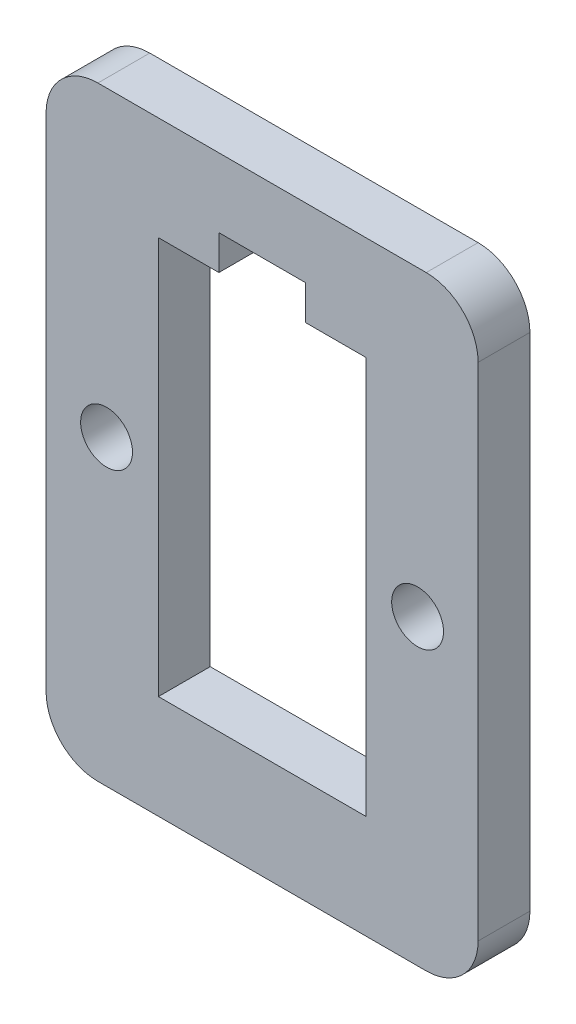
ISO-10303-21;
HEADER;
FILE_DESCRIPTION(('STEP AP214'),'2;1');
FILE_NAME('part.step','',(''),(''),'','','');
FILE_SCHEMA(('AUTOMOTIVE_DESIGN { 1 0 10303 214 1 1 1 1 }'));
ENDSEC;
DATA;
#1=APPLICATION_CONTEXT('core data for automotive mechanical design processes');
#2=APPLICATION_PROTOCOL_DEFINITION('international standard','automotive_design',2000,#1);
#3=PRODUCT_CONTEXT('',#1,'mechanical');
#4=PRODUCT('Part','Part','',(#3));
#5=PRODUCT_RELATED_PRODUCT_CATEGORY('part','',(#4));
#6=PRODUCT_DEFINITION_FORMATION('','',#4);
#7=PRODUCT_DEFINITION_CONTEXT('part definition',#1,'design');
#8=PRODUCT_DEFINITION('design','',#6,#7);
#9=PRODUCT_DEFINITION_SHAPE('','',#8);
#10=(LENGTH_UNIT() NAMED_UNIT(*) SI_UNIT(.MILLI.,.METRE.));
#11=(NAMED_UNIT(*) PLANE_ANGLE_UNIT() SI_UNIT($,.RADIAN.));
#12=(NAMED_UNIT(*) SI_UNIT($,.STERADIAN.) SOLID_ANGLE_UNIT());
#13=UNCERTAINTY_MEASURE_WITH_UNIT(LENGTH_MEASURE(1.E-05),#10,'distance_accuracy_value','');
#14=(GEOMETRIC_REPRESENTATION_CONTEXT(3) GLOBAL_UNCERTAINTY_ASSIGNED_CONTEXT((#13)) GLOBAL_UNIT_ASSIGNED_CONTEXT((#10,
#11,#12)) REPRESENTATION_CONTEXT('',''));
#15=CARTESIAN_POINT('',(0.,0.,0.));
#16=DIRECTION('',(0.,0.,1.));
#17=DIRECTION('',(1.,0.,0.));
#18=AXIS2_PLACEMENT_3D('',#15,#16,#17);
#19=CARTESIAN_POINT('',(155.0002,74.,3.));
#20=DIRECTION('',(0.,0.,1.));
#21=DIRECTION('',(1.,0.,0.));
#22=AXIS2_PLACEMENT_3D('',#19,#20,#21);
#23=PLANE('',#22);
#24=CARTESIAN_POINT('',(155.500199998333,88.4999999983335,3.));
#25=DIRECTION('',(0.,0.,1.));
#26=DIRECTION('',(1.,0.,0.));
#27=AXIS2_PLACEMENT_3D('',#24,#25,#26);
#28=CIRCLE('',#27,1.50000000166657);
#29=CARTESIAN_POINT('',(157.0002,88.4999999983335,3.));
#30=VERTEX_POINT('',#29);
#31=EDGE_CURVE('E184',#30,#30,#28,.T.);
#32=ORIENTED_EDGE('',*,*,#31,.F.);
#33=EDGE_LOOP('',(#32));
#34=FACE_BOUND('',#33,.T.);
#35=CARTESIAN_POINT('',(155.0002,74.,3.));
#36=DIRECTION('',(0.,0.,1.));
#37=DIRECTION('',(1.,0.,0.));
#38=AXIS2_PLACEMENT_3D('',#35,#36,#37);
#39=CIRCLE('',#38,2.99999999999998);
#40=CARTESIAN_POINT('',(152.0002,74.,3.));
#41=VERTEX_POINT('',#40);
#42=CARTESIAN_POINT('',(155.0002,71.,3.));
#43=VERTEX_POINT('',#42);
#44=EDGE_CURVE('E214',#41,#43,#39,.T.);
#45=ORIENTED_EDGE('',*,*,#44,.T.);
#46=DIRECTION('',(1.,0.,0.));
#47=VECTOR('',#46,1.);
#48=CARTESIAN_POINT('',(155.0002,71.,3.));
#49=LINE('',#48,#47);
#50=CARTESIAN_POINT('',(174.0002,71.,3.));
#51=VERTEX_POINT('',#50);
#52=EDGE_CURVE('E217',#43,#51,#49,.T.);
#53=ORIENTED_EDGE('',*,*,#52,.T.);
#54=CARTESIAN_POINT('',(174.0002,74.,3.));
#55=DIRECTION('',(0.,0.,1.));
#56=DIRECTION('',(1.,0.,0.));
#57=AXIS2_PLACEMENT_3D('',#54,#55,#56);
#58=CIRCLE('',#57,3.00000000000002);
#59=CARTESIAN_POINT('',(177.0002,74.,3.));
#60=VERTEX_POINT('',#59);
#61=EDGE_CURVE('E220',#51,#60,#58,.T.);
#62=ORIENTED_EDGE('',*,*,#61,.T.);
#63=DIRECTION('',(0.,1.,0.));
#64=VECTOR('',#63,1.);
#65=CARTESIAN_POINT('',(177.0002,74.,3.));
#66=LINE('',#65,#64);
#67=CARTESIAN_POINT('',(177.0002,103.,3.));
#68=VERTEX_POINT('',#67);
#69=EDGE_CURVE('E222',#60,#68,#66,.T.);
#70=ORIENTED_EDGE('',*,*,#69,.T.);
#71=CARTESIAN_POINT('',(174.0002,103.,3.));
#72=DIRECTION('',(0.,0.,1.));
#73=DIRECTION('',(1.,0.,0.));
#74=AXIS2_PLACEMENT_3D('',#71,#72,#73);
#75=CIRCLE('',#74,3.00000000000002);
#76=CARTESIAN_POINT('',(174.0002,106.,3.));
#77=VERTEX_POINT('',#76);
#78=EDGE_CURVE('E224',#68,#77,#75,.T.);
#79=ORIENTED_EDGE('',*,*,#78,.T.);
#80=DIRECTION('',(-1.,0.,0.));
#81=VECTOR('',#80,1.);
#82=CARTESIAN_POINT('',(155.0002,106.,3.));
#83=LINE('',#82,#81);
#84=CARTESIAN_POINT('',(155.0002,106.,3.));
#85=VERTEX_POINT('',#84);
#86=EDGE_CURVE('E226',#77,#85,#83,.T.);
#87=ORIENTED_EDGE('',*,*,#86,.T.);
#88=CARTESIAN_POINT('',(155.0002,103.,3.));
#89=DIRECTION('',(0.,0.,1.));
#90=DIRECTION('',(1.,0.,0.));
#91=AXIS2_PLACEMENT_3D('',#88,#89,#90);
#92=CIRCLE('',#91,2.99999999999998);
#93=CARTESIAN_POINT('',(152.0002,103.,3.));
#94=VERTEX_POINT('',#93);
#95=EDGE_CURVE('E228',#85,#94,#92,.T.);
#96=ORIENTED_EDGE('',*,*,#95,.T.);
#97=DIRECTION('',(0.,-1.,0.));
#98=VECTOR('',#97,1.);
#99=CARTESIAN_POINT('',(152.0002,103.,3.));
#100=LINE('',#99,#98);
#101=EDGE_CURVE('E230',#94,#41,#100,.T.);
#102=ORIENTED_EDGE('',*,*,#101,.T.);
#103=EDGE_LOOP('',(#45,#53,#62,#70,#79,#87,#96,#102));
#104=FACE_BOUND('',#103,.T.);
#105=DIRECTION('',(0.,1.,0.));
#106=VECTOR('',#105,1.);
#107=CARTESIAN_POINT('',(170.5002,76.9999999999999,3.));
#108=LINE('',#107,#106);
#109=CARTESIAN_POINT('',(170.5002,76.9999999999999,3.));
#110=VERTEX_POINT('',#109);
#111=CARTESIAN_POINT('',(170.5002,100.,3.));
#112=VERTEX_POINT('',#111);
#113=EDGE_CURVE('E154',#110,#112,#108,.T.);
#114=ORIENTED_EDGE('',*,*,#113,.F.);
#115=DIRECTION('',(1.,0.,0.));
#116=VECTOR('',#115,1.);
#117=CARTESIAN_POINT('',(158.5002,77.,3.));
#118=LINE('',#117,#116);
#119=CARTESIAN_POINT('',(158.5002,77.,3.));
#120=VERTEX_POINT('',#119);
#121=EDGE_CURVE('E146',#120,#110,#118,.T.);
#122=ORIENTED_EDGE('',*,*,#121,.F.);
#123=DIRECTION('',(0.,-1.,0.));
#124=VECTOR('',#123,1.);
#125=CARTESIAN_POINT('',(158.5002,100.,3.));
#126=LINE('',#125,#124);
#127=CARTESIAN_POINT('',(158.5002,100.,3.));
#128=VERTEX_POINT('',#127);
#129=EDGE_CURVE('E181',#128,#120,#126,.T.);
#130=ORIENTED_EDGE('',*,*,#129,.F.);
#131=DIRECTION('',(-1.,0.,0.));
#132=VECTOR('',#131,1.);
#133=CARTESIAN_POINT('',(162.0002,100.,3.));
#134=LINE('',#133,#132);
#135=CARTESIAN_POINT('',(162.0002,100.,3.));
#136=VERTEX_POINT('',#135);
#137=EDGE_CURVE('E179',#136,#128,#134,.T.);
#138=ORIENTED_EDGE('',*,*,#137,.F.);
#139=DIRECTION('',(0.,-1.,0.));
#140=VECTOR('',#139,1.);
#141=CARTESIAN_POINT('',(162.0002,102.0001,3.));
#142=LINE('',#141,#140);
#143=CARTESIAN_POINT('',(162.0002,102.0001,3.));
#144=VERTEX_POINT('',#143);
#145=EDGE_CURVE('E177',#144,#136,#142,.T.);
#146=ORIENTED_EDGE('',*,*,#145,.F.);
#147=DIRECTION('',(-1.,0.,0.));
#148=VECTOR('',#147,1.);
#149=CARTESIAN_POINT('',(167.0002,102.0001,3.));
#150=LINE('',#149,#148);
#151=CARTESIAN_POINT('',(167.0002,102.0001,3.));
#152=VERTEX_POINT('',#151);
#153=EDGE_CURVE('E175',#152,#144,#150,.T.);
#154=ORIENTED_EDGE('',*,*,#153,.F.);
#155=DIRECTION('',(0.,1.,0.));
#156=VECTOR('',#155,1.);
#157=CARTESIAN_POINT('',(167.0002,100.,3.));
#158=LINE('',#157,#156);
#159=CARTESIAN_POINT('',(167.0002,100.,3.));
#160=VERTEX_POINT('',#159);
#161=EDGE_CURVE('E170',#160,#152,#158,.T.);
#162=ORIENTED_EDGE('',*,*,#161,.F.);
#163=DIRECTION('',(-1.,0.,0.));
#164=VECTOR('',#163,1.);
#165=CARTESIAN_POINT('',(170.5002,100.,3.));
#166=LINE('',#165,#164);
#167=EDGE_CURVE('E168',#112,#160,#166,.T.);
#168=ORIENTED_EDGE('',*,*,#167,.F.);
#169=EDGE_LOOP('',(#114,#122,#130,#138,#146,#154,#162,#168));
#170=FACE_BOUND('',#169,.T.);
#171=CARTESIAN_POINT('',(173.500199998333,88.4999999983335,3.));
#172=DIRECTION('',(0.,0.,1.));
#173=DIRECTION('',(1.,0.,0.));
#174=AXIS2_PLACEMENT_3D('',#171,#172,#173);
#175=CIRCLE('',#174,1.50000000166663);
#176=CARTESIAN_POINT('',(175.0002,88.4999999983335,3.));
#177=VERTEX_POINT('',#176);
#178=EDGE_CURVE('E370',#177,#177,#175,.T.);
#179=ORIENTED_EDGE('',*,*,#178,.F.);
#180=EDGE_LOOP('',(#179));
#181=FACE_BOUND('',#180,.T.);
#182=ADVANCED_FACE('F33',(#34,#104,#170,#181),#23,.T.);
#183=CARTESIAN_POINT('',(155.0002,74.,0.));
#184=DIRECTION('',(0.,0.,1.));
#185=DIRECTION('',(1.,0.,0.));
#186=AXIS2_PLACEMENT_3D('',#183,#184,#185);
#187=PLANE('',#186);
#188=CARTESIAN_POINT('',(155.0002,74.,0.));
#189=DIRECTION('',(0.,0.,1.));
#190=DIRECTION('',(1.,0.,0.));
#191=AXIS2_PLACEMENT_3D('',#188,#189,#190);
#192=CIRCLE('',#191,2.99999999999998);
#193=CARTESIAN_POINT('',(152.0002,74.,0.));
#194=VERTEX_POINT('',#193);
#195=CARTESIAN_POINT('',(155.0002,71.,0.));
#196=VERTEX_POINT('',#195);
#197=EDGE_CURVE('E162',#194,#196,#192,.T.);
#198=ORIENTED_EDGE('',*,*,#197,.F.);
#199=DIRECTION('',(0.,-1.,0.));
#200=VECTOR('',#199,1.);
#201=CARTESIAN_POINT('',(152.0002,103.,0.));
#202=LINE('',#201,#200);
#203=CARTESIAN_POINT('',(152.0002,103.,0.));
#204=VERTEX_POINT('',#203);
#205=EDGE_CURVE('E218',#204,#194,#202,.T.);
#206=ORIENTED_EDGE('',*,*,#205,.F.);
#207=CARTESIAN_POINT('',(155.0002,103.,0.));
#208=DIRECTION('',(0.,0.,1.));
#209=DIRECTION('',(1.,0.,0.));
#210=AXIS2_PLACEMENT_3D('',#207,#208,#209);
#211=CIRCLE('',#210,2.99999999999998);
#212=CARTESIAN_POINT('',(155.0002,106.,0.));
#213=VERTEX_POINT('',#212);
#214=EDGE_CURVE('E245',#213,#204,#211,.T.);
#215=ORIENTED_EDGE('',*,*,#214,.F.);
#216=DIRECTION('',(-1.,0.,0.));
#217=VECTOR('',#216,1.);
#218=CARTESIAN_POINT('',(155.0002,106.,0.));
#219=LINE('',#218,#217);
#220=CARTESIAN_POINT('',(174.0002,106.,0.));
#221=VERTEX_POINT('',#220);
#222=EDGE_CURVE('E243',#221,#213,#219,.T.);
#223=ORIENTED_EDGE('',*,*,#222,.F.);
#224=CARTESIAN_POINT('',(174.0002,103.,0.));
#225=DIRECTION('',(0.,0.,1.));
#226=DIRECTION('',(1.,0.,0.));
#227=AXIS2_PLACEMENT_3D('',#224,#225,#226);
#228=CIRCLE('',#227,3.00000000000002);
#229=CARTESIAN_POINT('',(177.0002,103.,0.));
#230=VERTEX_POINT('',#229);
#231=EDGE_CURVE('E241',#230,#221,#228,.T.);
#232=ORIENTED_EDGE('',*,*,#231,.F.);
#233=DIRECTION('',(0.,1.,0.));
#234=VECTOR('',#233,1.);
#235=CARTESIAN_POINT('',(177.0002,74.,0.));
#236=LINE('',#235,#234);
#237=CARTESIAN_POINT('',(177.0002,74.,0.));
#238=VERTEX_POINT('',#237);
#239=EDGE_CURVE('E239',#238,#230,#236,.T.);
#240=ORIENTED_EDGE('',*,*,#239,.F.);
#241=CARTESIAN_POINT('',(174.0002,74.,0.));
#242=DIRECTION('',(0.,0.,1.));
#243=DIRECTION('',(1.,0.,0.));
#244=AXIS2_PLACEMENT_3D('',#241,#242,#243);
#245=CIRCLE('',#244,3.00000000000002);
#246=CARTESIAN_POINT('',(174.0002,71.,0.));
#247=VERTEX_POINT('',#246);
#248=EDGE_CURVE('E237',#247,#238,#245,.T.);
#249=ORIENTED_EDGE('',*,*,#248,.F.);
#250=DIRECTION('',(1.,0.,0.));
#251=VECTOR('',#250,1.);
#252=CARTESIAN_POINT('',(155.0002,71.,0.));
#253=LINE('',#252,#251);
#254=EDGE_CURVE('E235',#196,#247,#253,.T.);
#255=ORIENTED_EDGE('',*,*,#254,.F.);
#256=EDGE_LOOP('',(#198,#206,#215,#223,#232,#240,#249,#255));
#257=FACE_BOUND('',#256,.T.);
#258=DIRECTION('',(1.,0.,0.));
#259=VECTOR('',#258,1.);
#260=CARTESIAN_POINT('',(158.5002,77.,0.));
#261=LINE('',#260,#259);
#262=CARTESIAN_POINT('',(158.5002,77.,0.));
#263=VERTEX_POINT('',#262);
#264=CARTESIAN_POINT('',(170.5002,76.9999999999999,0.));
#265=VERTEX_POINT('',#264);
#266=EDGE_CURVE('E56',#263,#265,#261,.T.);
#267=ORIENTED_EDGE('',*,*,#266,.T.);
#268=DIRECTION('',(0.,1.,0.));
#269=VECTOR('',#268,1.);
#270=CARTESIAN_POINT('',(170.5002,76.9999999999999,0.));
#271=LINE('',#270,#269);
#272=CARTESIAN_POINT('',(170.5002,100.,0.));
#273=VERTEX_POINT('',#272);
#274=EDGE_CURVE('E161',#265,#273,#271,.T.);
#275=ORIENTED_EDGE('',*,*,#274,.T.);
#276=DIRECTION('',(-1.,0.,0.));
#277=VECTOR('',#276,1.);
#278=CARTESIAN_POINT('',(170.5002,100.,0.));
#279=LINE('',#278,#277);
#280=CARTESIAN_POINT('',(167.0002,100.,0.));
#281=VERTEX_POINT('',#280);
#282=EDGE_CURVE('E186',#273,#281,#279,.T.);
#283=ORIENTED_EDGE('',*,*,#282,.T.);
#284=DIRECTION('',(0.,1.,0.));
#285=VECTOR('',#284,1.);
#286=CARTESIAN_POINT('',(167.0002,100.,0.));
#287=LINE('',#286,#285);
#288=CARTESIAN_POINT('',(167.0002,102.0001,0.));
#289=VERTEX_POINT('',#288);
#290=EDGE_CURVE('E189',#281,#289,#287,.T.);
#291=ORIENTED_EDGE('',*,*,#290,.T.);
#292=DIRECTION('',(-1.,0.,0.));
#293=VECTOR('',#292,1.);
#294=CARTESIAN_POINT('',(167.0002,102.0001,0.));
#295=LINE('',#294,#293);
#296=CARTESIAN_POINT('',(162.0002,102.0001,0.));
#297=VERTEX_POINT('',#296);
#298=EDGE_CURVE('E192',#289,#297,#295,.T.);
#299=ORIENTED_EDGE('',*,*,#298,.T.);
#300=DIRECTION('',(0.,-1.,0.));
#301=VECTOR('',#300,1.);
#302=CARTESIAN_POINT('',(162.0002,102.0001,0.));
#303=LINE('',#302,#301);
#304=CARTESIAN_POINT('',(162.0002,100.,0.));
#305=VERTEX_POINT('',#304);
#306=EDGE_CURVE('E195',#297,#305,#303,.T.);
#307=ORIENTED_EDGE('',*,*,#306,.T.);
#308=DIRECTION('',(-1.,0.,0.));
#309=VECTOR('',#308,1.);
#310=CARTESIAN_POINT('',(162.0002,100.,0.));
#311=LINE('',#310,#309);
#312=CARTESIAN_POINT('',(158.5002,100.,0.));
#313=VERTEX_POINT('',#312);
#314=EDGE_CURVE('E198',#305,#313,#311,.T.);
#315=ORIENTED_EDGE('',*,*,#314,.T.);
#316=DIRECTION('',(0.,-1.,0.));
#317=VECTOR('',#316,1.);
#318=CARTESIAN_POINT('',(158.5002,100.,0.));
#319=LINE('',#318,#317);
#320=EDGE_CURVE('E155',#313,#263,#319,.T.);
#321=ORIENTED_EDGE('',*,*,#320,.T.);
#322=EDGE_LOOP('',(#267,#275,#283,#291,#299,#307,#315,#321));
#323=FACE_BOUND('',#322,.T.);
#324=CARTESIAN_POINT('',(155.500199998333,88.4999999983335,0.));
#325=DIRECTION('',(0.,0.,1.));
#326=DIRECTION('',(1.,0.,0.));
#327=AXIS2_PLACEMENT_3D('',#324,#325,#326);
#328=CIRCLE('',#327,1.50000000166657);
#329=CARTESIAN_POINT('',(157.0002,88.4999999983335,0.));
#330=VERTEX_POINT('',#329);
#331=EDGE_CURVE('E376',#330,#330,#328,.T.);
#332=ORIENTED_EDGE('',*,*,#331,.T.);
#333=EDGE_LOOP('',(#332));
#334=FACE_BOUND('',#333,.T.);
#335=CARTESIAN_POINT('',(173.500199998333,88.4999999983335,0.));
#336=DIRECTION('',(0.,0.,1.));
#337=DIRECTION('',(1.,0.,0.));
#338=AXIS2_PLACEMENT_3D('',#335,#336,#337);
#339=CIRCLE('',#338,1.50000000166663);
#340=CARTESIAN_POINT('',(175.0002,88.4999999983335,0.));
#341=VERTEX_POINT('',#340);
#342=EDGE_CURVE('E373',#341,#341,#339,.T.);
#343=ORIENTED_EDGE('',*,*,#342,.T.);
#344=EDGE_LOOP('',(#343));
#345=FACE_BOUND('',#344,.T.);
#346=ADVANCED_FACE('F275',(#257,#323,#334,#345),#187,.F.);
#347=CARTESIAN_POINT('',(155.0002,74.,3.));
#348=DIRECTION('',(0.,0.,-1.));
#349=DIRECTION('',(-1.,0.,0.));
#350=AXIS2_PLACEMENT_3D('',#347,#348,#349);
#351=CYLINDRICAL_SURFACE('',#350,2.99999999999998);
#352=ORIENTED_EDGE('',*,*,#197,.T.);
#353=DIRECTION('',(0.,0.,-1.));
#354=VECTOR('',#353,1.);
#355=CARTESIAN_POINT('',(155.0002,71.,3.));
#356=LINE('',#355,#354);
#357=EDGE_CURVE('E11',#43,#196,#356,.T.);
#358=ORIENTED_EDGE('',*,*,#357,.F.);
#359=ORIENTED_EDGE('',*,*,#44,.F.);
#360=DIRECTION('',(0.,0.,-1.));
#361=VECTOR('',#360,1.);
#362=CARTESIAN_POINT('',(152.0002,74.,3.));
#363=LINE('',#362,#361);
#364=EDGE_CURVE('E232',#41,#194,#363,.T.);
#365=ORIENTED_EDGE('',*,*,#364,.T.);
#366=EDGE_LOOP('',(#352,#358,#359,#365));
#367=FACE_BOUND('',#366,.T.);
#368=ADVANCED_FACE('F35',(#367),#351,.T.);
#369=CARTESIAN_POINT('',(155.0002,71.,3.));
#370=DIRECTION('',(0.,1.,0.));
#371=DIRECTION('',(0.,0.,1.));
#372=AXIS2_PLACEMENT_3D('',#369,#370,#371);
#373=PLANE('',#372);
#374=ORIENTED_EDGE('',*,*,#254,.T.);
#375=DIRECTION('',(0.,0.,-1.));
#376=VECTOR('',#375,1.);
#377=CARTESIAN_POINT('',(174.0002,71.,3.));
#378=LINE('',#377,#376);
#379=EDGE_CURVE('E41',#51,#247,#378,.T.);
#380=ORIENTED_EDGE('',*,*,#379,.F.);
#381=ORIENTED_EDGE('',*,*,#52,.F.);
#382=ORIENTED_EDGE('',*,*,#357,.T.);
#383=EDGE_LOOP('',(#374,#380,#381,#382));
#384=FACE_BOUND('',#383,.T.);
#385=ADVANCED_FACE('F292',(#384),#373,.F.);
#386=CARTESIAN_POINT('',(174.0002,74.,3.));
#387=DIRECTION('',(0.,0.,-1.));
#388=DIRECTION('',(-1.,0.,0.));
#389=AXIS2_PLACEMENT_3D('',#386,#387,#388);
#390=CYLINDRICAL_SURFACE('',#389,3.00000000000002);
#391=ORIENTED_EDGE('',*,*,#248,.T.);
#392=DIRECTION('',(0.,0.,-1.));
#393=VECTOR('',#392,1.);
#394=CARTESIAN_POINT('',(177.0002,74.,3.));
#395=LINE('',#394,#393);
#396=EDGE_CURVE('E262',#60,#238,#395,.T.);
#397=ORIENTED_EDGE('',*,*,#396,.F.);
#398=ORIENTED_EDGE('',*,*,#61,.F.);
#399=ORIENTED_EDGE('',*,*,#379,.T.);
#400=EDGE_LOOP('',(#391,#397,#398,#399));
#401=FACE_BOUND('',#400,.T.);
#402=ADVANCED_FACE('F269',(#401),#390,.T.);
#403=CARTESIAN_POINT('',(177.0002,74.,3.));
#404=DIRECTION('',(-1.,0.,0.));
#405=DIRECTION('',(0.,0.,1.));
#406=AXIS2_PLACEMENT_3D('',#403,#404,#405);
#407=PLANE('',#406);
#408=ORIENTED_EDGE('',*,*,#239,.T.);
#409=DIRECTION('',(0.,0.,-1.));
#410=VECTOR('',#409,1.);
#411=CARTESIAN_POINT('',(177.0002,103.,3.));
#412=LINE('',#411,#410);
#413=EDGE_CURVE('E259',#68,#230,#412,.T.);
#414=ORIENTED_EDGE('',*,*,#413,.F.);
#415=ORIENTED_EDGE('',*,*,#69,.F.);
#416=ORIENTED_EDGE('',*,*,#396,.T.);
#417=EDGE_LOOP('',(#408,#414,#415,#416));
#418=FACE_BOUND('',#417,.T.);
#419=ADVANCED_FACE('F281',(#418),#407,.F.);
#420=CARTESIAN_POINT('',(174.0002,103.,3.));
#421=DIRECTION('',(0.,0.,-1.));
#422=DIRECTION('',(-1.,0.,0.));
#423=AXIS2_PLACEMENT_3D('',#420,#421,#422);
#424=CYLINDRICAL_SURFACE('',#423,3.00000000000002);
#425=ORIENTED_EDGE('',*,*,#231,.T.);
#426=DIRECTION('',(0.,0.,-1.));
#427=VECTOR('',#426,1.);
#428=CARTESIAN_POINT('',(174.0002,106.,3.));
#429=LINE('',#428,#427);
#430=EDGE_CURVE('E256',#77,#221,#429,.T.);
#431=ORIENTED_EDGE('',*,*,#430,.F.);
#432=ORIENTED_EDGE('',*,*,#78,.F.);
#433=ORIENTED_EDGE('',*,*,#413,.T.);
#434=EDGE_LOOP('',(#425,#431,#432,#433));
#435=FACE_BOUND('',#434,.T.);
#436=ADVANCED_FACE('F285',(#435),#424,.T.);
#437=CARTESIAN_POINT('',(155.0002,106.,3.));
#438=DIRECTION('',(0.,-1.,0.));
#439=DIRECTION('',(0.,0.,-1.));
#440=AXIS2_PLACEMENT_3D('',#437,#438,#439);
#441=PLANE('',#440);
#442=ORIENTED_EDGE('',*,*,#222,.T.);
#443=DIRECTION('',(0.,0.,-1.));
#444=VECTOR('',#443,1.);
#445=CARTESIAN_POINT('',(155.0002,106.,3.));
#446=LINE('',#445,#444);
#447=EDGE_CURVE('E253',#85,#213,#446,.T.);
#448=ORIENTED_EDGE('',*,*,#447,.F.);
#449=ORIENTED_EDGE('',*,*,#86,.F.);
#450=ORIENTED_EDGE('',*,*,#430,.T.);
#451=EDGE_LOOP('',(#442,#448,#449,#450));
#452=FACE_BOUND('',#451,.T.);
#453=ADVANCED_FACE('F305',(#452),#441,.F.);
#454=CARTESIAN_POINT('',(155.0002,103.,3.));
#455=DIRECTION('',(0.,0.,-1.));
#456=DIRECTION('',(-1.,0.,0.));
#457=AXIS2_PLACEMENT_3D('',#454,#455,#456);
#458=CYLINDRICAL_SURFACE('',#457,2.99999999999998);
#459=ORIENTED_EDGE('',*,*,#214,.T.);
#460=DIRECTION('',(0.,0.,-1.));
#461=VECTOR('',#460,1.);
#462=CARTESIAN_POINT('',(152.0002,103.,3.));
#463=LINE('',#462,#461);
#464=EDGE_CURVE('E250',#94,#204,#463,.T.);
#465=ORIENTED_EDGE('',*,*,#464,.F.);
#466=ORIENTED_EDGE('',*,*,#95,.F.);
#467=ORIENTED_EDGE('',*,*,#447,.T.);
#468=EDGE_LOOP('',(#459,#465,#466,#467));
#469=FACE_BOUND('',#468,.T.);
#470=ADVANCED_FACE('F303',(#469),#458,.T.);
#471=CARTESIAN_POINT('',(152.0002,103.,3.));
#472=DIRECTION('',(1.,0.,0.));
#473=DIRECTION('',(0.,0.,-1.));
#474=AXIS2_PLACEMENT_3D('',#471,#472,#473);
#475=PLANE('',#474);
#476=ORIENTED_EDGE('',*,*,#205,.T.);
#477=ORIENTED_EDGE('',*,*,#364,.F.);
#478=ORIENTED_EDGE('',*,*,#101,.F.);
#479=ORIENTED_EDGE('',*,*,#464,.T.);
#480=EDGE_LOOP('',(#476,#477,#478,#479));
#481=FACE_BOUND('',#480,.T.);
#482=ADVANCED_FACE('F298',(#481),#475,.F.);
#483=CARTESIAN_POINT('',(158.5002,77.,3.));
#484=DIRECTION('',(0.,1.,0.));
#485=DIRECTION('',(-1.,0.,0.));
#486=AXIS2_PLACEMENT_3D('',#483,#484,#485);
#487=PLANE('',#486);
#488=ORIENTED_EDGE('',*,*,#266,.F.);
#489=DIRECTION('',(0.,0.,-1.));
#490=VECTOR('',#489,1.);
#491=CARTESIAN_POINT('',(158.5002,77.,3.));
#492=LINE('',#491,#490);
#493=EDGE_CURVE('E150',#120,#263,#492,.T.);
#494=ORIENTED_EDGE('',*,*,#493,.F.);
#495=ORIENTED_EDGE('',*,*,#121,.T.);
#496=DIRECTION('',(0.,0.,-1.));
#497=VECTOR('',#496,1.);
#498=CARTESIAN_POINT('',(170.5002,76.9999999999999,3.));
#499=LINE('',#498,#497);
#500=EDGE_CURVE('E149',#110,#265,#499,.T.);
#501=ORIENTED_EDGE('',*,*,#500,.T.);
#502=EDGE_LOOP('',(#488,#494,#495,#501));
#503=FACE_BOUND('',#502,.T.);
#504=ADVANCED_FACE('F148',(#503),#487,.T.);
#505=CARTESIAN_POINT('',(170.5002,76.9999999999999,3.));
#506=DIRECTION('',(-1.,0.,0.));
#507=DIRECTION('',(0.,0.,1.));
#508=AXIS2_PLACEMENT_3D('',#505,#506,#507);
#509=PLANE('',#508);
#510=ORIENTED_EDGE('',*,*,#274,.F.);
#511=ORIENTED_EDGE('',*,*,#500,.F.);
#512=ORIENTED_EDGE('',*,*,#113,.T.);
#513=DIRECTION('',(0.,0.,-1.));
#514=VECTOR('',#513,1.);
#515=CARTESIAN_POINT('',(170.5002,100.,3.));
#516=LINE('',#515,#514);
#517=EDGE_CURVE('E163',#112,#273,#516,.T.);
#518=ORIENTED_EDGE('',*,*,#517,.T.);
#519=EDGE_LOOP('',(#510,#511,#512,#518));
#520=FACE_BOUND('',#519,.T.);
#521=ADVANCED_FACE('F158',(#520),#509,.T.);
#522=CARTESIAN_POINT('',(170.5002,100.,3.));
#523=DIRECTION('',(0.,-1.,0.));
#524=DIRECTION('',(0.,0.,-1.));
#525=AXIS2_PLACEMENT_3D('',#522,#523,#524);
#526=PLANE('',#525);
#527=ORIENTED_EDGE('',*,*,#282,.F.);
#528=ORIENTED_EDGE('',*,*,#517,.F.);
#529=ORIENTED_EDGE('',*,*,#167,.T.);
#530=DIRECTION('',(0.,0.,-1.));
#531=VECTOR('',#530,1.);
#532=CARTESIAN_POINT('',(167.0002,100.,3.));
#533=LINE('',#532,#531);
#534=EDGE_CURVE('E211',#160,#281,#533,.T.);
#535=ORIENTED_EDGE('',*,*,#534,.T.);
#536=EDGE_LOOP('',(#527,#528,#529,#535));
#537=FACE_BOUND('',#536,.T.);
#538=ADVANCED_FACE('F332',(#537),#526,.T.);
#539=CARTESIAN_POINT('',(167.0002,100.,3.));
#540=DIRECTION('',(-1.,0.,0.));
#541=DIRECTION('',(0.,0.,1.));
#542=AXIS2_PLACEMENT_3D('',#539,#540,#541);
#543=PLANE('',#542);
#544=ORIENTED_EDGE('',*,*,#290,.F.);
#545=ORIENTED_EDGE('',*,*,#534,.F.);
#546=ORIENTED_EDGE('',*,*,#161,.T.);
#547=DIRECTION('',(0.,0.,-1.));
#548=VECTOR('',#547,1.);
#549=CARTESIAN_POINT('',(167.0002,102.0001,3.));
#550=LINE('',#549,#548);
#551=EDGE_CURVE('E209',#152,#289,#550,.T.);
#552=ORIENTED_EDGE('',*,*,#551,.T.);
#553=EDGE_LOOP('',(#544,#545,#546,#552));
#554=FACE_BOUND('',#553,.T.);
#555=ADVANCED_FACE('F336',(#554),#543,.T.);
#556=CARTESIAN_POINT('',(167.0002,102.0001,3.));
#557=DIRECTION('',(0.,-1.,0.));
#558=DIRECTION('',(0.,0.,-1.));
#559=AXIS2_PLACEMENT_3D('',#556,#557,#558);
#560=PLANE('',#559);
#561=ORIENTED_EDGE('',*,*,#298,.F.);
#562=ORIENTED_EDGE('',*,*,#551,.F.);
#563=ORIENTED_EDGE('',*,*,#153,.T.);
#564=DIRECTION('',(0.,0.,-1.));
#565=VECTOR('',#564,1.);
#566=CARTESIAN_POINT('',(162.0002,102.0001,3.));
#567=LINE('',#566,#565);
#568=EDGE_CURVE('E207',#144,#297,#567,.T.);
#569=ORIENTED_EDGE('',*,*,#568,.T.);
#570=EDGE_LOOP('',(#561,#562,#563,#569));
#571=FACE_BOUND('',#570,.T.);
#572=ADVANCED_FACE('F342',(#571),#560,.T.);
#573=CARTESIAN_POINT('',(162.0002,102.0001,3.));
#574=DIRECTION('',(1.,0.,0.));
#575=DIRECTION('',(0.,0.,-1.));
#576=AXIS2_PLACEMENT_3D('',#573,#574,#575);
#577=PLANE('',#576);
#578=ORIENTED_EDGE('',*,*,#306,.F.);
#579=ORIENTED_EDGE('',*,*,#568,.F.);
#580=ORIENTED_EDGE('',*,*,#145,.T.);
#581=DIRECTION('',(0.,0.,-1.));
#582=VECTOR('',#581,1.);
#583=CARTESIAN_POINT('',(162.0002,100.,3.));
#584=LINE('',#583,#582);
#585=EDGE_CURVE('E205',#136,#305,#584,.T.);
#586=ORIENTED_EDGE('',*,*,#585,.T.);
#587=EDGE_LOOP('',(#578,#579,#580,#586));
#588=FACE_BOUND('',#587,.T.);
#589=ADVANCED_FACE('F346',(#588),#577,.T.);
#590=CARTESIAN_POINT('',(162.0002,100.,3.));
#591=DIRECTION('',(0.,-1.,0.));
#592=DIRECTION('',(0.,0.,-1.));
#593=AXIS2_PLACEMENT_3D('',#590,#591,#592);
#594=PLANE('',#593);
#595=ORIENTED_EDGE('',*,*,#314,.F.);
#596=ORIENTED_EDGE('',*,*,#585,.F.);
#597=ORIENTED_EDGE('',*,*,#137,.T.);
#598=DIRECTION('',(0.,0.,-1.));
#599=VECTOR('',#598,1.);
#600=CARTESIAN_POINT('',(158.5002,100.,3.));
#601=LINE('',#600,#599);
#602=EDGE_CURVE('E48',#128,#313,#601,.T.);
#603=ORIENTED_EDGE('',*,*,#602,.T.);
#604=EDGE_LOOP('',(#595,#596,#597,#603));
#605=FACE_BOUND('',#604,.T.);
#606=ADVANCED_FACE('F350',(#605),#594,.T.);
#607=CARTESIAN_POINT('',(158.5002,100.,3.));
#608=DIRECTION('',(1.,0.,0.));
#609=DIRECTION('',(0.,0.,-1.));
#610=AXIS2_PLACEMENT_3D('',#607,#608,#609);
#611=PLANE('',#610);
#612=ORIENTED_EDGE('',*,*,#320,.F.);
#613=ORIENTED_EDGE('',*,*,#602,.F.);
#614=ORIENTED_EDGE('',*,*,#129,.T.);
#615=ORIENTED_EDGE('',*,*,#493,.T.);
#616=EDGE_LOOP('',(#612,#613,#614,#615));
#617=FACE_BOUND('',#616,.T.);
#618=ADVANCED_FACE('F354',(#617),#611,.T.);
#619=CARTESIAN_POINT('',(155.500199998333,88.4999999983335,3.));
#620=DIRECTION('',(0.,0.,-1.));
#621=DIRECTION('',(-1.,0.,0.));
#622=AXIS2_PLACEMENT_3D('',#619,#620,#621);
#623=CYLINDRICAL_SURFACE('',#622,1.50000000166657);
#624=ORIENTED_EDGE('',*,*,#31,.T.);
#625=EDGE_LOOP('',(#624));
#626=FACE_BOUND('',#625,.T.);
#627=ORIENTED_EDGE('',*,*,#331,.F.);
#628=EDGE_LOOP('',(#627));
#629=FACE_BOUND('',#628,.T.);
#630=ADVANCED_FACE('F358',(#626,#629),#623,.F.);
#631=CARTESIAN_POINT('',(173.500199998333,88.4999999983335,3.));
#632=DIRECTION('',(0.,0.,-1.));
#633=DIRECTION('',(-1.,0.,0.));
#634=AXIS2_PLACEMENT_3D('',#631,#632,#633);
#635=CYLINDRICAL_SURFACE('',#634,1.50000000166663);
#636=ORIENTED_EDGE('',*,*,#178,.T.);
#637=EDGE_LOOP('',(#636));
#638=FACE_BOUND('',#637,.T.);
#639=ORIENTED_EDGE('',*,*,#342,.F.);
#640=EDGE_LOOP('',(#639));
#641=FACE_BOUND('',#640,.T.);
#642=ADVANCED_FACE('F361',(#638,#641),#635,.F.);
#643=CLOSED_SHELL('',(#182,#346,#368,#385,#402,#419,#436,#453,#470,#482,#504,#521,#538,#555,
#572,#589,#606,#618,#630,#642));
#644=MANIFOLD_SOLID_BREP('B2',#643);
#645=ADVANCED_BREP_SHAPE_REPRESENTATION('',(#18,#644),#14);
#646=SHAPE_DEFINITION_REPRESENTATION(#9,#645);
ENDSEC;
END-ISO-10303-21;
